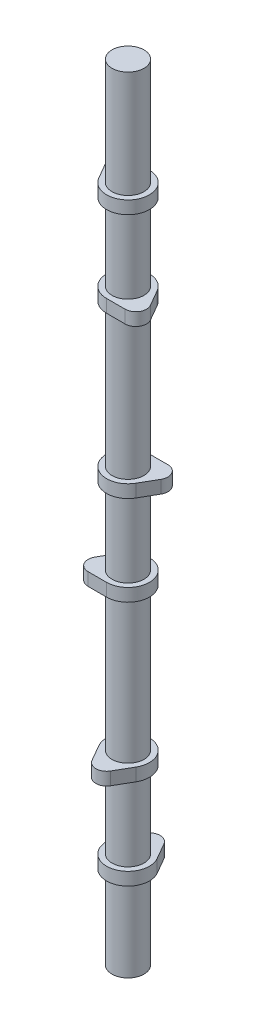
ISO-10303-21;
HEADER;
FILE_DESCRIPTION(('STEP AP214'),'2;1');
FILE_NAME('part.step','',(''),(''),'','','');
FILE_SCHEMA(('AUTOMOTIVE_DESIGN { 1 0 10303 214 1 1 1 1 }'));
ENDSEC;
DATA;
#1=APPLICATION_CONTEXT('core data for automotive mechanical design processes');
#2=APPLICATION_PROTOCOL_DEFINITION('international standard','automotive_design',2000,#1);
#3=PRODUCT_CONTEXT('',#1,'mechanical');
#4=PRODUCT('Part','Part','',(#3));
#5=PRODUCT_RELATED_PRODUCT_CATEGORY('part','',(#4));
#6=PRODUCT_DEFINITION_FORMATION('','',#4);
#7=PRODUCT_DEFINITION_CONTEXT('part definition',#1,'design');
#8=PRODUCT_DEFINITION('design','',#6,#7);
#9=PRODUCT_DEFINITION_SHAPE('','',#8);
#10=(LENGTH_UNIT() NAMED_UNIT(*) SI_UNIT(.MILLI.,.METRE.));
#11=(NAMED_UNIT(*) PLANE_ANGLE_UNIT() SI_UNIT($,.RADIAN.));
#12=(NAMED_UNIT(*) SI_UNIT($,.STERADIAN.) SOLID_ANGLE_UNIT());
#13=UNCERTAINTY_MEASURE_WITH_UNIT(LENGTH_MEASURE(1.E-05),#10,'distance_accuracy_value','');
#14=(GEOMETRIC_REPRESENTATION_CONTEXT(3) GLOBAL_UNCERTAINTY_ASSIGNED_CONTEXT((#13)) GLOBAL_UNIT_ASSIGNED_CONTEXT((#10,
#11,#12)) REPRESENTATION_CONTEXT('',''));
#15=CARTESIAN_POINT('',(0.,0.,0.));
#16=DIRECTION('',(0.,0.,1.));
#17=DIRECTION('',(1.,0.,0.));
#18=AXIS2_PLACEMENT_3D('',#15,#16,#17);
#19=CARTESIAN_POINT('',(0.,416.56,0.));
#20=DIRECTION('',(0.,-1.,0.));
#21=DIRECTION('',(0.,0.,-1.));
#22=AXIS2_PLACEMENT_3D('',#19,#20,#21);
#23=CYLINDRICAL_SURFACE('',#22,9.5);
#24=CARTESIAN_POINT('',(0.,207.01,0.));
#25=DIRECTION('',(0.,1.,0.));
#26=DIRECTION('',(0.,0.,1.));
#27=AXIS2_PLACEMENT_3D('',#24,#25,#26);
#28=CIRCLE('',#27,9.5);
#29=CARTESIAN_POINT('',(0.,207.01,9.5));
#30=VERTEX_POINT('',#29);
#31=EDGE_CURVE('E297',#30,#30,#28,.T.);
#32=ORIENTED_EDGE('',*,*,#31,.T.);
#33=EDGE_LOOP('',(#32));
#34=FACE_BOUND('',#33,.T.);
#35=CARTESIAN_POINT('',(0.,292.1,0.));
#36=DIRECTION('',(0.,1.,0.));
#37=DIRECTION('',(0.,0.,1.));
#38=AXIS2_PLACEMENT_3D('',#35,#36,#37);
#39=CIRCLE('',#38,9.5);
#40=CARTESIAN_POINT('',(0.,292.1,9.5));
#41=VERTEX_POINT('',#40);
#42=EDGE_CURVE('E11',#41,#41,#39,.T.);
#43=ORIENTED_EDGE('',*,*,#42,.F.);
#44=EDGE_LOOP('',(#43));
#45=FACE_BOUND('',#44,.T.);
#46=ADVANCED_FACE('F32',(#34,#45),#23,.T.);
#47=CARTESIAN_POINT('',(0.,153.67,0.));
#48=DIRECTION('',(0.,1.,0.));
#49=DIRECTION('',(0.,0.,1.));
#50=AXIS2_PLACEMENT_3D('',#47,#48,#49);
#51=CIRCLE('',#50,9.5);
#52=CARTESIAN_POINT('',(0.,153.67,9.5));
#53=VERTEX_POINT('',#52);
#54=EDGE_CURVE('E328',#53,#53,#51,.T.);
#55=ORIENTED_EDGE('',*,*,#54,.T.);
#56=EDGE_LOOP('',(#55));
#57=FACE_BOUND('',#56,.T.);
#58=CARTESIAN_POINT('',(0.,199.39,0.));
#59=DIRECTION('',(0.,1.,0.));
#60=DIRECTION('',(0.,0.,1.));
#61=AXIS2_PLACEMENT_3D('',#58,#59,#60);
#62=CIRCLE('',#61,9.5);
#63=CARTESIAN_POINT('',(0.,199.39,9.5));
#64=VERTEX_POINT('',#63);
#65=EDGE_CURVE('E401',#64,#64,#62,.T.);
#66=ORIENTED_EDGE('',*,*,#65,.F.);
#67=EDGE_LOOP('',(#66));
#68=FACE_BOUND('',#67,.T.);
#69=ADVANCED_FACE('F450',(#57,#68),#23,.T.);
#70=CARTESIAN_POINT('',(0.,60.96,0.));
#71=DIRECTION('',(0.,1.,0.));
#72=DIRECTION('',(0.,0.,1.));
#73=AXIS2_PLACEMENT_3D('',#70,#71,#72);
#74=CIRCLE('',#73,9.5);
#75=CARTESIAN_POINT('',(0.,60.96,9.5));
#76=VERTEX_POINT('',#75);
#77=EDGE_CURVE('E359',#76,#76,#74,.T.);
#78=ORIENTED_EDGE('',*,*,#77,.T.);
#79=EDGE_LOOP('',(#78));
#80=FACE_BOUND('',#79,.T.);
#81=CARTESIAN_POINT('',(0.,146.05,0.));
#82=DIRECTION('',(0.,1.,0.));
#83=DIRECTION('',(0.,0.,1.));
#84=AXIS2_PLACEMENT_3D('',#81,#82,#83);
#85=CIRCLE('',#84,9.5);
#86=CARTESIAN_POINT('',(0.,146.05,9.5));
#87=VERTEX_POINT('',#86);
#88=EDGE_CURVE('E396',#87,#87,#85,.T.);
#89=ORIENTED_EDGE('',*,*,#88,.F.);
#90=EDGE_LOOP('',(#89));
#91=FACE_BOUND('',#90,.T.);
#92=ADVANCED_FACE('F458',(#80,#91),#23,.T.);
#93=CARTESIAN_POINT('',(0.,7.62000000000002,0.));
#94=DIRECTION('',(0.,1.,0.));
#95=DIRECTION('',(0.,0.,1.));
#96=AXIS2_PLACEMENT_3D('',#93,#94,#95);
#97=CIRCLE('',#96,9.5);
#98=CARTESIAN_POINT('',(0.,7.62000000000002,9.5));
#99=VERTEX_POINT('',#98);
#100=EDGE_CURVE('E363',#99,#99,#97,.F.);
#101=ORIENTED_EDGE('',*,*,#100,.F.);
#102=EDGE_LOOP('',(#101));
#103=FACE_BOUND('',#102,.T.);
#104=CARTESIAN_POINT('',(0.,53.34,0.));
#105=DIRECTION('',(0.,1.,0.));
#106=DIRECTION('',(0.,0.,1.));
#107=AXIS2_PLACEMENT_3D('',#104,#105,#106);
#108=CIRCLE('',#107,9.5);
#109=CARTESIAN_POINT('',(0.,53.34,9.5));
#110=VERTEX_POINT('',#109);
#111=EDGE_CURVE('E393',#110,#110,#108,.T.);
#112=ORIENTED_EDGE('',*,*,#111,.F.);
#113=EDGE_LOOP('',(#112));
#114=FACE_BOUND('',#113,.T.);
#115=ADVANCED_FACE('F476',(#103,#114),#23,.T.);
#116=CARTESIAN_POINT('',(0.,7.62,-12.7));
#117=DIRECTION('',(0.,-1.,0.));
#118=DIRECTION('',(0.,0.,-1.));
#119=AXIS2_PLACEMENT_3D('',#116,#117,#118);
#120=CYLINDRICAL_SURFACE('',#119,6.35);
#121=CARTESIAN_POINT('',(0.,0.,-12.7));
#122=DIRECTION('',(0.,1.,0.));
#123=DIRECTION('',(0.,0.,1.));
#124=AXIS2_PLACEMENT_3D('',#121,#122,#123);
#125=CIRCLE('',#124,6.35);
#126=CARTESIAN_POINT('',(5.49926131403118,0.,-15.875));
#127=VERTEX_POINT('',#126);
#128=CARTESIAN_POINT('',(-5.49926131403118,0.,-15.875));
#129=VERTEX_POINT('',#128);
#130=EDGE_CURVE('E369',#127,#129,#125,.T.);
#131=ORIENTED_EDGE('',*,*,#130,.T.);
#132=DIRECTION('',(0.,-1.,0.));
#133=VECTOR('',#132,1.);
#134=CARTESIAN_POINT('',(-5.49926131403118,7.62,-15.875));
#135=LINE('',#134,#133);
#136=CARTESIAN_POINT('',(-5.49926131403118,7.62,-15.875));
#137=VERTEX_POINT('',#136);
#138=EDGE_CURVE('E388',#137,#129,#135,.T.);
#139=ORIENTED_EDGE('',*,*,#138,.F.);
#140=CARTESIAN_POINT('',(0.,7.62,-12.7));
#141=DIRECTION('',(0.,1.,0.));
#142=DIRECTION('',(0.,0.,1.));
#143=AXIS2_PLACEMENT_3D('',#140,#141,#142);
#144=CIRCLE('',#143,6.35);
#145=CARTESIAN_POINT('',(5.49926131403118,7.62,-15.875));
#146=VERTEX_POINT('',#145);
#147=EDGE_CURVE('E370',#146,#137,#144,.T.);
#148=ORIENTED_EDGE('',*,*,#147,.F.);
#149=DIRECTION('',(0.,-1.,0.));
#150=VECTOR('',#149,1.);
#151=CARTESIAN_POINT('',(5.49926131403118,7.62,-15.875));
#152=LINE('',#151,#150);
#153=EDGE_CURVE('E376',#146,#127,#152,.T.);
#154=ORIENTED_EDGE('',*,*,#153,.T.);
#155=EDGE_LOOP('',(#131,#139,#148,#154));
#156=FACE_BOUND('',#155,.T.);
#157=ADVANCED_FACE('F34',(#156),#120,.T.);
#158=CARTESIAN_POINT('',(-5.49926131403118,7.62,-15.875));
#159=DIRECTION('',(0.866025403784439,0.,0.5));
#160=DIRECTION('',(0.5,0.,-0.866025403784439));
#161=AXIS2_PLACEMENT_3D('',#158,#159,#160);
#162=PLANE('',#161);
#163=DIRECTION('',(-0.5,0.,0.866025403784439));
#164=VECTOR('',#163,1.);
#165=CARTESIAN_POINT('',(-5.49926131403118,0.,-15.875));
#166=LINE('',#165,#164);
#167=CARTESIAN_POINT('',(-10.9985226280624,0.,-6.35));
#168=VERTEX_POINT('',#167);
#169=EDGE_CURVE('E379',#129,#168,#166,.T.);
#170=ORIENTED_EDGE('',*,*,#169,.T.);
#171=DIRECTION('',(0.,-1.,0.));
#172=VECTOR('',#171,1.);
#173=CARTESIAN_POINT('',(-10.9985226280624,7.62,-6.35));
#174=LINE('',#173,#172);
#175=CARTESIAN_POINT('',(-10.9985226280624,7.62,-6.35));
#176=VERTEX_POINT('',#175);
#177=EDGE_CURVE('E386',#176,#168,#174,.T.);
#178=ORIENTED_EDGE('',*,*,#177,.F.);
#179=DIRECTION('',(-0.5,0.,0.866025403784439));
#180=VECTOR('',#179,1.);
#181=CARTESIAN_POINT('',(-5.49926131403118,7.62,-15.875));
#182=LINE('',#181,#180);
#183=EDGE_CURVE('E82',#137,#176,#182,.T.);
#184=ORIENTED_EDGE('',*,*,#183,.F.);
#185=ORIENTED_EDGE('',*,*,#138,.T.);
#186=EDGE_LOOP('',(#170,#178,#184,#185));
#187=FACE_BOUND('',#186,.T.);
#188=ADVANCED_FACE('F493',(#187),#162,.F.);
#189=CARTESIAN_POINT('',(0.,7.62,0.));
#190=DIRECTION('',(0.,-1.,0.));
#191=DIRECTION('',(0.,0.,-1.));
#192=AXIS2_PLACEMENT_3D('',#189,#190,#191);
#193=CYLINDRICAL_SURFACE('',#192,12.7);
#194=CARTESIAN_POINT('',(0.,0.,0.));
#195=DIRECTION('',(0.,1.,0.));
#196=DIRECTION('',(0.,0.,1.));
#197=AXIS2_PLACEMENT_3D('',#194,#195,#196);
#198=CIRCLE('',#197,12.7);
#199=CARTESIAN_POINT('',(10.9985226280624,0.,-6.35000000000001));
#200=VERTEX_POINT('',#199);
#201=EDGE_CURVE('E68',#168,#200,#198,.T.);
#202=ORIENTED_EDGE('',*,*,#201,.T.);
#203=DIRECTION('',(0.,-1.,0.));
#204=VECTOR('',#203,1.);
#205=CARTESIAN_POINT('',(10.9985226280624,7.62,-6.35000000000001));
#206=LINE('',#205,#204);
#207=CARTESIAN_POINT('',(10.9985226280624,7.62,-6.35000000000001));
#208=VERTEX_POINT('',#207);
#209=EDGE_CURVE('E384',#208,#200,#206,.T.);
#210=ORIENTED_EDGE('',*,*,#209,.F.);
#211=CARTESIAN_POINT('',(0.,7.62,0.));
#212=DIRECTION('',(0.,1.,0.));
#213=DIRECTION('',(0.,0.,1.));
#214=AXIS2_PLACEMENT_3D('',#211,#212,#213);
#215=CIRCLE('',#214,12.7);
#216=EDGE_CURVE('E373',#176,#208,#215,.T.);
#217=ORIENTED_EDGE('',*,*,#216,.F.);
#218=ORIENTED_EDGE('',*,*,#177,.T.);
#219=EDGE_LOOP('',(#202,#210,#217,#218));
#220=FACE_BOUND('',#219,.T.);
#221=ADVANCED_FACE('F824',(#220),#193,.T.);
#222=CARTESIAN_POINT('',(5.49926131403118,7.62,-15.875));
#223=DIRECTION('',(-0.866025403784438,0.,0.5));
#224=DIRECTION('',(0.5,0.,0.866025403784439));
#225=AXIS2_PLACEMENT_3D('',#222,#223,#224);
#226=PLANE('',#225);
#227=DIRECTION('',(-0.5,0.,-0.866025403784439));
#228=VECTOR('',#227,1.);
#229=CARTESIAN_POINT('',(5.49926131403118,0.,-15.875));
#230=LINE('',#229,#228);
#231=EDGE_CURVE('E74',#200,#127,#230,.T.);
#232=ORIENTED_EDGE('',*,*,#231,.T.);
#233=ORIENTED_EDGE('',*,*,#153,.F.);
#234=DIRECTION('',(-0.5,0.,-0.866025403784439));
#235=VECTOR('',#234,1.);
#236=CARTESIAN_POINT('',(5.49926131403118,7.62,-15.875));
#237=LINE('',#236,#235);
#238=EDGE_CURVE('E50',#208,#146,#237,.T.);
#239=ORIENTED_EDGE('',*,*,#238,.F.);
#240=ORIENTED_EDGE('',*,*,#209,.T.);
#241=EDGE_LOOP('',(#232,#233,#239,#240));
#242=FACE_BOUND('',#241,.T.);
#243=ADVANCED_FACE('F818',(#242),#226,.F.);
#244=CARTESIAN_POINT('',(0.,7.62,-12.7));
#245=DIRECTION('',(0.,1.,0.));
#246=DIRECTION('',(0.,0.,1.));
#247=AXIS2_PLACEMENT_3D('',#244,#245,#246);
#248=PLANE('',#247);
#249=ORIENTED_EDGE('',*,*,#100,.T.);
#250=EDGE_LOOP('',(#249));
#251=FACE_BOUND('',#250,.T.);
#252=ORIENTED_EDGE('',*,*,#147,.T.);
#253=ORIENTED_EDGE('',*,*,#183,.T.);
#254=ORIENTED_EDGE('',*,*,#216,.T.);
#255=ORIENTED_EDGE('',*,*,#238,.T.);
#256=EDGE_LOOP('',(#252,#253,#254,#255));
#257=FACE_BOUND('',#256,.T.);
#258=ADVANCED_FACE('F823',(#251,#257),#248,.T.);
#259=CARTESIAN_POINT('',(0.,0.,-12.7));
#260=DIRECTION('',(0.,1.,0.));
#261=DIRECTION('',(0.,0.,1.));
#262=AXIS2_PLACEMENT_3D('',#259,#260,#261);
#263=PLANE('',#262);
#264=CARTESIAN_POINT('',(0.,0.,0.));
#265=DIRECTION('',(0.,1.,0.));
#266=DIRECTION('',(0.,0.,1.));
#267=AXIS2_PLACEMENT_3D('',#264,#265,#266);
#268=CIRCLE('',#267,9.5);
#269=CARTESIAN_POINT('',(0.,0.,9.5));
#270=VERTEX_POINT('',#269);
#271=EDGE_CURVE('E390',#270,#270,#268,.F.);
#272=ORIENTED_EDGE('',*,*,#271,.F.);
#273=EDGE_LOOP('',(#272));
#274=FACE_BOUND('',#273,.T.);
#275=ORIENTED_EDGE('',*,*,#130,.F.);
#276=ORIENTED_EDGE('',*,*,#231,.F.);
#277=ORIENTED_EDGE('',*,*,#201,.F.);
#278=ORIENTED_EDGE('',*,*,#169,.F.);
#279=EDGE_LOOP('',(#275,#276,#277,#278));
#280=FACE_BOUND('',#279,.T.);
#281=ADVANCED_FACE('F484',(#274,#280),#263,.F.);
#282=CARTESIAN_POINT('',(0.,-49.53,0.));
#283=DIRECTION('',(0.,1.,0.));
#284=DIRECTION('',(0.,0.,1.));
#285=AXIS2_PLACEMENT_3D('',#282,#283,#284);
#286=PLANE('',#285);
#287=CARTESIAN_POINT('',(0.,-49.53,0.));
#288=DIRECTION('',(0.,1.,0.));
#289=DIRECTION('',(0.,0.,1.));
#290=AXIS2_PLACEMENT_3D('',#287,#288,#289);
#291=CIRCLE('',#290,9.5);
#292=CARTESIAN_POINT('',(0.,-49.53,9.5));
#293=VERTEX_POINT('',#292);
#294=EDGE_CURVE('E364',#293,#293,#291,.T.);
#295=ORIENTED_EDGE('',*,*,#294,.F.);
#296=EDGE_LOOP('',(#295));
#297=FACE_BOUND('',#296,.T.);
#298=ADVANCED_FACE('F474',(#297),#286,.F.);
#299=ORIENTED_EDGE('',*,*,#294,.T.);
#300=EDGE_LOOP('',(#299));
#301=FACE_BOUND('',#300,.T.);
#302=ORIENTED_EDGE('',*,*,#271,.T.);
#303=EDGE_LOOP('',(#302));
#304=FACE_BOUND('',#303,.T.);
#305=ADVANCED_FACE('F465',(#301,#304),#23,.T.);
#306=CARTESIAN_POINT('',(0.,60.96,12.7));
#307=DIRECTION('',(0.,-1.,0.));
#308=DIRECTION('',(0.,0.,1.));
#309=AXIS2_PLACEMENT_3D('',#306,#307,#308);
#310=CYLINDRICAL_SURFACE('',#309,6.35);
#311=CARTESIAN_POINT('',(0.,53.34,12.7));
#312=DIRECTION('',(0.,1.,0.));
#313=DIRECTION('',(0.,0.,-1.));
#314=AXIS2_PLACEMENT_3D('',#311,#312,#313);
#315=CIRCLE('',#314,6.35);
#316=CARTESIAN_POINT('',(-5.49926131403129,53.34,15.875));
#317=VERTEX_POINT('',#316);
#318=CARTESIAN_POINT('',(5.49926131403107,53.34,15.875));
#319=VERTEX_POINT('',#318);
#320=EDGE_CURVE('E340',#317,#319,#315,.T.);
#321=ORIENTED_EDGE('',*,*,#320,.T.);
#322=DIRECTION('',(0.,-1.,0.));
#323=VECTOR('',#322,1.);
#324=CARTESIAN_POINT('',(5.49926131403107,60.96,15.875));
#325=LINE('',#324,#323);
#326=CARTESIAN_POINT('',(5.49926131403107,60.96,15.875));
#327=VERTEX_POINT('',#326);
#328=EDGE_CURVE('E356',#327,#319,#325,.T.);
#329=ORIENTED_EDGE('',*,*,#328,.F.);
#330=CARTESIAN_POINT('',(0.,60.96,12.7));
#331=DIRECTION('',(0.,1.,0.));
#332=DIRECTION('',(0.,0.,-1.));
#333=AXIS2_PLACEMENT_3D('',#330,#331,#332);
#334=CIRCLE('',#333,6.35);
#335=CARTESIAN_POINT('',(-5.49926131403129,60.96,15.875));
#336=VERTEX_POINT('',#335);
#337=EDGE_CURVE('E329',#336,#327,#334,.T.);
#338=ORIENTED_EDGE('',*,*,#337,.F.);
#339=DIRECTION('',(0.,-1.,0.));
#340=VECTOR('',#339,1.);
#341=CARTESIAN_POINT('',(-5.49926131403129,60.96,15.875));
#342=LINE('',#341,#340);
#343=EDGE_CURVE('E339',#336,#317,#342,.T.);
#344=ORIENTED_EDGE('',*,*,#343,.T.);
#345=EDGE_LOOP('',(#321,#329,#338,#344));
#346=FACE_BOUND('',#345,.T.);
#347=ADVANCED_FACE('F473',(#346),#310,.T.);
#348=CARTESIAN_POINT('',(5.49926131403107,60.96,15.875));
#349=DIRECTION('',(-0.866025403784435,0.,-0.500000000000006));
#350=DIRECTION('',(-0.500000000000006,0.,0.866025403784435));
#351=AXIS2_PLACEMENT_3D('',#348,#349,#350);
#352=PLANE('',#351);
#353=DIRECTION('',(0.500000000000006,0.,-0.866025403784435));
#354=VECTOR('',#353,1.);
#355=CARTESIAN_POINT('',(5.49926131403107,53.34,15.875));
#356=LINE('',#355,#354);
#357=CARTESIAN_POINT('',(10.9985226280623,53.34,6.35000000000008));
#358=VERTEX_POINT('',#357);
#359=EDGE_CURVE('E343',#319,#358,#356,.T.);
#360=ORIENTED_EDGE('',*,*,#359,.T.);
#361=DIRECTION('',(0.,-1.,0.));
#362=VECTOR('',#361,1.);
#363=CARTESIAN_POINT('',(10.9985226280623,60.96,6.35000000000008));
#364=LINE('',#363,#362);
#365=CARTESIAN_POINT('',(10.9985226280623,60.96,6.35000000000008));
#366=VERTEX_POINT('',#365);
#367=EDGE_CURVE('E353',#366,#358,#364,.T.);
#368=ORIENTED_EDGE('',*,*,#367,.F.);
#369=DIRECTION('',(0.500000000000006,0.,-0.866025403784435));
#370=VECTOR('',#369,1.);
#371=CARTESIAN_POINT('',(5.49926131403107,60.96,15.875));
#372=LINE('',#371,#370);
#373=EDGE_CURVE('E332',#327,#366,#372,.T.);
#374=ORIENTED_EDGE('',*,*,#373,.F.);
#375=ORIENTED_EDGE('',*,*,#328,.T.);
#376=EDGE_LOOP('',(#360,#368,#374,#375));
#377=FACE_BOUND('',#376,.T.);
#378=ADVANCED_FACE('F481',(#377),#352,.F.);
#379=CARTESIAN_POINT('',(0.,60.96,0.));
#380=DIRECTION('',(0.,-1.,0.));
#381=DIRECTION('',(0.,0.,1.));
#382=AXIS2_PLACEMENT_3D('',#379,#380,#381);
#383=CYLINDRICAL_SURFACE('',#382,12.7);
#384=CARTESIAN_POINT('',(0.,53.34,0.));
#385=DIRECTION('',(0.,1.,0.));
#386=DIRECTION('',(0.,0.,-1.));
#387=AXIS2_PLACEMENT_3D('',#384,#385,#386);
#388=CIRCLE('',#387,12.7);
#389=CARTESIAN_POINT('',(-10.9985226280624,53.34,6.34999999999993));
#390=VERTEX_POINT('',#389);
#391=EDGE_CURVE('E345',#358,#390,#388,.T.);
#392=ORIENTED_EDGE('',*,*,#391,.T.);
#393=DIRECTION('',(0.,-1.,0.));
#394=VECTOR('',#393,1.);
#395=CARTESIAN_POINT('',(-10.9985226280624,60.96,6.34999999999993));
#396=LINE('',#395,#394);
#397=CARTESIAN_POINT('',(-10.9985226280624,60.96,6.34999999999993));
#398=VERTEX_POINT('',#397);
#399=EDGE_CURVE('E350',#398,#390,#396,.T.);
#400=ORIENTED_EDGE('',*,*,#399,.F.);
#401=CARTESIAN_POINT('',(0.,60.96,0.));
#402=DIRECTION('',(0.,1.,0.));
#403=DIRECTION('',(0.,0.,-1.));
#404=AXIS2_PLACEMENT_3D('',#401,#402,#403);
#405=CIRCLE('',#404,12.7);
#406=EDGE_CURVE('E335',#366,#398,#405,.T.);
#407=ORIENTED_EDGE('',*,*,#406,.F.);
#408=ORIENTED_EDGE('',*,*,#367,.T.);
#409=EDGE_LOOP('',(#392,#400,#407,#408));
#410=FACE_BOUND('',#409,.T.);
#411=ADVANCED_FACE('F518',(#410),#383,.T.);
#412=CARTESIAN_POINT('',(-5.49926131403129,60.96,15.875));
#413=DIRECTION('',(0.866025403784442,0.,-0.499999999999994));
#414=DIRECTION('',(-0.499999999999994,0.,-0.866025403784442));
#415=AXIS2_PLACEMENT_3D('',#412,#413,#414);
#416=PLANE('',#415);
#417=DIRECTION('',(0.499999999999994,0.,0.866025403784442));
#418=VECTOR('',#417,1.);
#419=CARTESIAN_POINT('',(-5.49926131403129,53.34,15.875));
#420=LINE('',#419,#418);
#421=EDGE_CURVE('E333',#390,#317,#420,.T.);
#422=ORIENTED_EDGE('',*,*,#421,.T.);
#423=ORIENTED_EDGE('',*,*,#343,.F.);
#424=DIRECTION('',(0.499999999999994,0.,0.866025403784442));
#425=VECTOR('',#424,1.);
#426=CARTESIAN_POINT('',(-5.49926131403129,60.96,15.875));
#427=LINE('',#426,#425);
#428=EDGE_CURVE('E337',#398,#336,#427,.T.);
#429=ORIENTED_EDGE('',*,*,#428,.F.);
#430=ORIENTED_EDGE('',*,*,#399,.T.);
#431=EDGE_LOOP('',(#422,#423,#429,#430));
#432=FACE_BOUND('',#431,.T.);
#433=ADVANCED_FACE('F514',(#432),#416,.F.);
#434=CARTESIAN_POINT('',(0.,60.96,12.7));
#435=DIRECTION('',(0.,1.,0.));
#436=DIRECTION('',(0.,0.,-1.));
#437=AXIS2_PLACEMENT_3D('',#434,#435,#436);
#438=PLANE('',#437);
#439=ORIENTED_EDGE('',*,*,#77,.F.);
#440=EDGE_LOOP('',(#439));
#441=FACE_BOUND('',#440,.T.);
#442=ORIENTED_EDGE('',*,*,#337,.T.);
#443=ORIENTED_EDGE('',*,*,#373,.T.);
#444=ORIENTED_EDGE('',*,*,#406,.T.);
#445=ORIENTED_EDGE('',*,*,#428,.T.);
#446=EDGE_LOOP('',(#442,#443,#444,#445));
#447=FACE_BOUND('',#446,.T.);
#448=ADVANCED_FACE('F504',(#441,#447),#438,.T.);
#449=CARTESIAN_POINT('',(0.,53.34,12.7));
#450=DIRECTION('',(0.,1.,0.));
#451=DIRECTION('',(0.,0.,-1.));
#452=AXIS2_PLACEMENT_3D('',#449,#450,#451);
#453=PLANE('',#452);
#454=ORIENTED_EDGE('',*,*,#111,.T.);
#455=EDGE_LOOP('',(#454));
#456=FACE_BOUND('',#455,.T.);
#457=ORIENTED_EDGE('',*,*,#320,.F.);
#458=ORIENTED_EDGE('',*,*,#421,.F.);
#459=ORIENTED_EDGE('',*,*,#391,.F.);
#460=ORIENTED_EDGE('',*,*,#359,.F.);
#461=EDGE_LOOP('',(#457,#458,#459,#460));
#462=FACE_BOUND('',#461,.T.);
#463=ADVANCED_FACE('F500',(#456,#462),#453,.F.);
#464=CARTESIAN_POINT('',(-10.9985226280623,153.67,6.35000000000005));
#465=DIRECTION('',(0.,-1.,0.));
#466=DIRECTION('',(-0.866025403784436,0.,0.500000000000004));
#467=AXIS2_PLACEMENT_3D('',#464,#465,#466);
#468=CYLINDRICAL_SURFACE('',#467,6.35);
#469=CARTESIAN_POINT('',(-10.9985226280623,146.05,6.35000000000005));
#470=DIRECTION('',(0.,1.,0.));
#471=DIRECTION('',(0.866025403784436,0.,-0.500000000000004));
#472=AXIS2_PLACEMENT_3D('',#469,#470,#471);
#473=CIRCLE('',#472,6.35);
#474=CARTESIAN_POINT('',(-16.4977839420935,146.05,3.17500000000008));
#475=VERTEX_POINT('',#474);
#476=CARTESIAN_POINT('',(-10.9985226280623,146.05,12.7000000000001));
#477=VERTEX_POINT('',#476);
#478=EDGE_CURVE('E309',#475,#477,#473,.T.);
#479=ORIENTED_EDGE('',*,*,#478,.T.);
#480=DIRECTION('',(0.,-1.,0.));
#481=VECTOR('',#480,1.);
#482=CARTESIAN_POINT('',(-10.9985226280623,153.67,12.7000000000001));
#483=LINE('',#482,#481);
#484=CARTESIAN_POINT('',(-10.9985226280623,153.67,12.7000000000001));
#485=VERTEX_POINT('',#484);
#486=EDGE_CURVE('E325',#485,#477,#483,.T.);
#487=ORIENTED_EDGE('',*,*,#486,.F.);
#488=CARTESIAN_POINT('',(-10.9985226280623,153.67,6.35000000000005));
#489=DIRECTION('',(0.,1.,0.));
#490=DIRECTION('',(0.866025403784436,0.,-0.500000000000004));
#491=AXIS2_PLACEMENT_3D('',#488,#489,#490);
#492=CIRCLE('',#491,6.35);
#493=CARTESIAN_POINT('',(-16.4977839420935,153.67,3.17500000000008));
#494=VERTEX_POINT('',#493);
#495=EDGE_CURVE('E298',#494,#485,#492,.T.);
#496=ORIENTED_EDGE('',*,*,#495,.F.);
#497=DIRECTION('',(0.,-1.,0.));
#498=VECTOR('',#497,1.);
#499=CARTESIAN_POINT('',(-16.4977839420935,153.67,3.17500000000008));
#500=LINE('',#499,#498);
#501=EDGE_CURVE('E308',#494,#475,#500,.T.);
#502=ORIENTED_EDGE('',*,*,#501,.T.);
#503=EDGE_LOOP('',(#479,#487,#496,#502));
#504=FACE_BOUND('',#503,.T.);
#505=ADVANCED_FACE('F503',(#504),#468,.T.);
#506=CARTESIAN_POINT('',(-10.9985226280623,153.67,12.7000000000001));
#507=DIRECTION('',(0.,0.,-1.));
#508=DIRECTION('',(-1.,0.,0.));
#509=AXIS2_PLACEMENT_3D('',#506,#507,#508);
#510=PLANE('',#509);
#511=DIRECTION('',(1.,0.,0.));
#512=VECTOR('',#511,1.);
#513=CARTESIAN_POINT('',(-10.9985226280623,146.05,12.7000000000001));
#514=LINE('',#513,#512);
#515=CARTESIAN_POINT('',(0.,146.05,12.7));
#516=VERTEX_POINT('',#515);
#517=EDGE_CURVE('E312',#477,#516,#514,.T.);
#518=ORIENTED_EDGE('',*,*,#517,.T.);
#519=DIRECTION('',(0.,-1.,0.));
#520=VECTOR('',#519,1.);
#521=CARTESIAN_POINT('',(0.,153.67,12.7));
#522=LINE('',#521,#520);
#523=CARTESIAN_POINT('',(0.,153.67,12.7));
#524=VERTEX_POINT('',#523);
#525=EDGE_CURVE('E322',#524,#516,#522,.T.);
#526=ORIENTED_EDGE('',*,*,#525,.F.);
#527=DIRECTION('',(1.,0.,0.));
#528=VECTOR('',#527,1.);
#529=CARTESIAN_POINT('',(-10.9985226280623,153.67,12.7000000000001));
#530=LINE('',#529,#528);
#531=EDGE_CURVE('E301',#485,#524,#530,.T.);
#532=ORIENTED_EDGE('',*,*,#531,.F.);
#533=ORIENTED_EDGE('',*,*,#486,.T.);
#534=EDGE_LOOP('',(#518,#526,#532,#533));
#535=FACE_BOUND('',#534,.T.);
#536=ADVANCED_FACE('F567',(#535),#510,.F.);
#537=CARTESIAN_POINT('',(0.,153.67,0.));
#538=DIRECTION('',(0.,-1.,0.));
#539=DIRECTION('',(-0.866025403784436,0.,0.500000000000004));
#540=AXIS2_PLACEMENT_3D('',#537,#538,#539);
#541=CYLINDRICAL_SURFACE('',#540,12.7);
#542=CARTESIAN_POINT('',(0.,146.05,0.));
#543=DIRECTION('',(0.,1.,0.));
#544=DIRECTION('',(0.866025403784436,0.,-0.500000000000004));
#545=AXIS2_PLACEMENT_3D('',#542,#543,#544);
#546=CIRCLE('',#545,12.7);
#547=CARTESIAN_POINT('',(-10.9985226280624,146.05,-6.34999999999994));
#548=VERTEX_POINT('',#547);
#549=EDGE_CURVE('E314',#516,#548,#546,.T.);
#550=ORIENTED_EDGE('',*,*,#549,.T.);
#551=DIRECTION('',(0.,-1.,0.));
#552=VECTOR('',#551,1.);
#553=CARTESIAN_POINT('',(-10.9985226280624,153.67,-6.34999999999994));
#554=LINE('',#553,#552);
#555=CARTESIAN_POINT('',(-10.9985226280624,153.67,-6.34999999999994));
#556=VERTEX_POINT('',#555);
#557=EDGE_CURVE('E319',#556,#548,#554,.T.);
#558=ORIENTED_EDGE('',*,*,#557,.F.);
#559=CARTESIAN_POINT('',(0.,153.67,0.));
#560=DIRECTION('',(0.,1.,0.));
#561=DIRECTION('',(0.866025403784436,0.,-0.500000000000004));
#562=AXIS2_PLACEMENT_3D('',#559,#560,#561);
#563=CIRCLE('',#562,12.7);
#564=EDGE_CURVE('E304',#524,#556,#563,.T.);
#565=ORIENTED_EDGE('',*,*,#564,.F.);
#566=ORIENTED_EDGE('',*,*,#525,.T.);
#567=EDGE_LOOP('',(#550,#558,#565,#566));
#568=FACE_BOUND('',#567,.T.);
#569=ADVANCED_FACE('F576',(#568),#541,.T.);
#570=CARTESIAN_POINT('',(-16.4977839420935,153.67,3.17500000000008));
#571=DIRECTION('',(0.866025403784441,0.,0.499999999999996));
#572=DIRECTION('',(0.499999999999996,0.,-0.866025403784441));
#573=AXIS2_PLACEMENT_3D('',#570,#571,#572);
#574=PLANE('',#573);
#575=DIRECTION('',(-0.499999999999996,0.,0.866025403784441));
#576=VECTOR('',#575,1.);
#577=CARTESIAN_POINT('',(-16.4977839420935,146.05,3.17500000000008));
#578=LINE('',#577,#576);
#579=EDGE_CURVE('E302',#548,#475,#578,.T.);
#580=ORIENTED_EDGE('',*,*,#579,.T.);
#581=ORIENTED_EDGE('',*,*,#501,.F.);
#582=DIRECTION('',(-0.499999999999996,0.,0.866025403784441));
#583=VECTOR('',#582,1.);
#584=CARTESIAN_POINT('',(-16.4977839420935,153.67,3.17500000000008));
#585=LINE('',#584,#583);
#586=EDGE_CURVE('E306',#556,#494,#585,.T.);
#587=ORIENTED_EDGE('',*,*,#586,.F.);
#588=ORIENTED_EDGE('',*,*,#557,.T.);
#589=EDGE_LOOP('',(#580,#581,#587,#588));
#590=FACE_BOUND('',#589,.T.);
#591=ADVANCED_FACE('F585',(#590),#574,.F.);
#592=CARTESIAN_POINT('',(-10.9985226280623,153.67,6.35000000000005));
#593=DIRECTION('',(0.,1.,0.));
#594=DIRECTION('',(0.866025403784436,0.,-0.500000000000004));
#595=AXIS2_PLACEMENT_3D('',#592,#593,#594);
#596=PLANE('',#595);
#597=ORIENTED_EDGE('',*,*,#54,.F.);
#598=EDGE_LOOP('',(#597));
#599=FACE_BOUND('',#598,.T.);
#600=ORIENTED_EDGE('',*,*,#495,.T.);
#601=ORIENTED_EDGE('',*,*,#531,.T.);
#602=ORIENTED_EDGE('',*,*,#564,.T.);
#603=ORIENTED_EDGE('',*,*,#586,.T.);
#604=EDGE_LOOP('',(#600,#601,#602,#603));
#605=FACE_BOUND('',#604,.T.);
#606=ADVANCED_FACE('F595',(#599,#605),#596,.T.);
#607=CARTESIAN_POINT('',(-10.9985226280623,146.05,6.35000000000005));
#608=DIRECTION('',(0.,1.,0.));
#609=DIRECTION('',(0.866025403784436,0.,-0.500000000000004));
#610=AXIS2_PLACEMENT_3D('',#607,#608,#609);
#611=PLANE('',#610);
#612=ORIENTED_EDGE('',*,*,#88,.T.);
#613=EDGE_LOOP('',(#612));
#614=FACE_BOUND('',#613,.T.);
#615=ORIENTED_EDGE('',*,*,#478,.F.);
#616=ORIENTED_EDGE('',*,*,#579,.F.);
#617=ORIENTED_EDGE('',*,*,#549,.F.);
#618=ORIENTED_EDGE('',*,*,#517,.F.);
#619=EDGE_LOOP('',(#615,#616,#617,#618));
#620=FACE_BOUND('',#619,.T.);
#621=ADVANCED_FACE('F605',(#614,#620),#611,.F.);
#622=CARTESIAN_POINT('',(10.9985226280624,207.01,-6.34999999999997));
#623=DIRECTION('',(0.,-1.,0.));
#624=DIRECTION('',(0.86602540378444,0.,-0.499999999999998));
#625=AXIS2_PLACEMENT_3D('',#622,#623,#624);
#626=CYLINDRICAL_SURFACE('',#625,6.35);
#627=CARTESIAN_POINT('',(10.9985226280624,199.39,-6.34999999999997));
#628=DIRECTION('',(0.,1.,0.));
#629=DIRECTION('',(-0.86602540378444,0.,0.499999999999998));
#630=AXIS2_PLACEMENT_3D('',#627,#628,#629);
#631=CIRCLE('',#630,6.35);
#632=CARTESIAN_POINT('',(16.4977839420936,199.39,-3.17499999999996));
#633=VERTEX_POINT('',#632);
#634=CARTESIAN_POINT('',(10.9985226280624,199.39,-12.7));
#635=VERTEX_POINT('',#634);
#636=EDGE_CURVE('E278',#633,#635,#631,.T.);
#637=ORIENTED_EDGE('',*,*,#636,.T.);
#638=DIRECTION('',(0.,-1.,0.));
#639=VECTOR('',#638,1.);
#640=CARTESIAN_POINT('',(10.9985226280624,207.01,-12.7));
#641=LINE('',#640,#639);
#642=CARTESIAN_POINT('',(10.9985226280624,207.01,-12.7));
#643=VERTEX_POINT('',#642);
#644=EDGE_CURVE('E294',#643,#635,#641,.T.);
#645=ORIENTED_EDGE('',*,*,#644,.F.);
#646=CARTESIAN_POINT('',(10.9985226280624,207.01,-6.34999999999997));
#647=DIRECTION('',(0.,1.,0.));
#648=DIRECTION('',(-0.86602540378444,0.,0.499999999999998));
#649=AXIS2_PLACEMENT_3D('',#646,#647,#648);
#650=CIRCLE('',#649,6.35);
#651=CARTESIAN_POINT('',(16.4977839420936,207.01,-3.17499999999996));
#652=VERTEX_POINT('',#651);
#653=EDGE_CURVE('E267',#652,#643,#650,.T.);
#654=ORIENTED_EDGE('',*,*,#653,.F.);
#655=DIRECTION('',(0.,-1.,0.));
#656=VECTOR('',#655,1.);
#657=CARTESIAN_POINT('',(16.4977839420936,207.01,-3.17499999999996));
#658=LINE('',#657,#656);
#659=EDGE_CURVE('E277',#652,#633,#658,.T.);
#660=ORIENTED_EDGE('',*,*,#659,.T.);
#661=EDGE_LOOP('',(#637,#645,#654,#660));
#662=FACE_BOUND('',#661,.T.);
#663=ADVANCED_FACE('F615',(#662),#626,.T.);
#664=CARTESIAN_POINT('',(10.9985226280624,207.01,-12.7));
#665=DIRECTION('',(0.,0.,1.));
#666=DIRECTION('',(1.,0.,0.));
#667=AXIS2_PLACEMENT_3D('',#664,#665,#666);
#668=PLANE('',#667);
#669=DIRECTION('',(-1.,0.,0.));
#670=VECTOR('',#669,1.);
#671=CARTESIAN_POINT('',(10.9985226280624,199.39,-12.7));
#672=LINE('',#671,#670);
#673=CARTESIAN_POINT('',(0.,199.39,-12.7));
#674=VERTEX_POINT('',#673);
#675=EDGE_CURVE('E281',#635,#674,#672,.T.);
#676=ORIENTED_EDGE('',*,*,#675,.T.);
#677=DIRECTION('',(0.,-1.,0.));
#678=VECTOR('',#677,1.);
#679=CARTESIAN_POINT('',(0.,207.01,-12.7));
#680=LINE('',#679,#678);
#681=CARTESIAN_POINT('',(0.,207.01,-12.7));
#682=VERTEX_POINT('',#681);
#683=EDGE_CURVE('E291',#682,#674,#680,.T.);
#684=ORIENTED_EDGE('',*,*,#683,.F.);
#685=DIRECTION('',(-1.,0.,0.));
#686=VECTOR('',#685,1.);
#687=CARTESIAN_POINT('',(10.9985226280624,207.01,-12.7));
#688=LINE('',#687,#686);
#689=EDGE_CURVE('E270',#643,#682,#688,.T.);
#690=ORIENTED_EDGE('',*,*,#689,.F.);
#691=ORIENTED_EDGE('',*,*,#644,.T.);
#692=EDGE_LOOP('',(#676,#684,#690,#691));
#693=FACE_BOUND('',#692,.T.);
#694=ADVANCED_FACE('F625',(#693),#668,.F.);
#695=CARTESIAN_POINT('',(0.,207.01,0.));
#696=DIRECTION('',(0.,-1.,0.));
#697=DIRECTION('',(0.86602540378444,0.,-0.499999999999998));
#698=AXIS2_PLACEMENT_3D('',#695,#696,#697);
#699=CYLINDRICAL_SURFACE('',#698,12.7);
#700=CARTESIAN_POINT('',(0.,199.39,0.));
#701=DIRECTION('',(0.,1.,0.));
#702=DIRECTION('',(-0.86602540378444,0.,0.499999999999998));
#703=AXIS2_PLACEMENT_3D('',#700,#701,#702);
#704=CIRCLE('',#703,12.7);
#705=CARTESIAN_POINT('',(10.9985226280624,199.39,6.35000000000001));
#706=VERTEX_POINT('',#705);
#707=EDGE_CURVE('E283',#674,#706,#704,.T.);
#708=ORIENTED_EDGE('',*,*,#707,.T.);
#709=DIRECTION('',(0.,-1.,0.));
#710=VECTOR('',#709,1.);
#711=CARTESIAN_POINT('',(10.9985226280624,207.01,6.35000000000001));
#712=LINE('',#711,#710);
#713=CARTESIAN_POINT('',(10.9985226280624,207.01,6.35000000000001));
#714=VERTEX_POINT('',#713);
#715=EDGE_CURVE('E288',#714,#706,#712,.T.);
#716=ORIENTED_EDGE('',*,*,#715,.F.);
#717=CARTESIAN_POINT('',(0.,207.01,0.));
#718=DIRECTION('',(0.,1.,0.));
#719=DIRECTION('',(-0.86602540378444,0.,0.499999999999998));
#720=AXIS2_PLACEMENT_3D('',#717,#718,#719);
#721=CIRCLE('',#720,12.7);
#722=EDGE_CURVE('E273',#682,#714,#721,.T.);
#723=ORIENTED_EDGE('',*,*,#722,.F.);
#724=ORIENTED_EDGE('',*,*,#683,.T.);
#725=EDGE_LOOP('',(#708,#716,#723,#724));
#726=FACE_BOUND('',#725,.T.);
#727=ADVANCED_FACE('F635',(#726),#699,.T.);
#728=CARTESIAN_POINT('',(16.4977839420936,207.01,-3.17499999999996));
#729=DIRECTION('',(-0.866025403784437,0.,-0.500000000000002));
#730=DIRECTION('',(-0.500000000000002,0.,0.866025403784438));
#731=AXIS2_PLACEMENT_3D('',#728,#729,#730);
#732=PLANE('',#731);
#733=DIRECTION('',(0.500000000000002,0.,-0.866025403784438));
#734=VECTOR('',#733,1.);
#735=CARTESIAN_POINT('',(16.4977839420936,199.39,-3.17499999999996));
#736=LINE('',#735,#734);
#737=EDGE_CURVE('E271',#706,#633,#736,.T.);
#738=ORIENTED_EDGE('',*,*,#737,.T.);
#739=ORIENTED_EDGE('',*,*,#659,.F.);
#740=DIRECTION('',(0.500000000000002,0.,-0.866025403784438));
#741=VECTOR('',#740,1.);
#742=CARTESIAN_POINT('',(16.4977839420936,207.01,-3.17499999999996));
#743=LINE('',#742,#741);
#744=EDGE_CURVE('E275',#714,#652,#743,.T.);
#745=ORIENTED_EDGE('',*,*,#744,.F.);
#746=ORIENTED_EDGE('',*,*,#715,.T.);
#747=EDGE_LOOP('',(#738,#739,#745,#746));
#748=FACE_BOUND('',#747,.T.);
#749=ADVANCED_FACE('F645',(#748),#732,.F.);
#750=CARTESIAN_POINT('',(10.9985226280624,207.01,-6.34999999999997));
#751=DIRECTION('',(0.,1.,0.));
#752=DIRECTION('',(-0.86602540378444,0.,0.499999999999998));
#753=AXIS2_PLACEMENT_3D('',#750,#751,#752);
#754=PLANE('',#753);
#755=ORIENTED_EDGE('',*,*,#31,.F.);
#756=EDGE_LOOP('',(#755));
#757=FACE_BOUND('',#756,.T.);
#758=ORIENTED_EDGE('',*,*,#653,.T.);
#759=ORIENTED_EDGE('',*,*,#689,.T.);
#760=ORIENTED_EDGE('',*,*,#722,.T.);
#761=ORIENTED_EDGE('',*,*,#744,.T.);
#762=EDGE_LOOP('',(#758,#759,#760,#761));
#763=FACE_BOUND('',#762,.T.);
#764=ADVANCED_FACE('F655',(#757,#763),#754,.T.);
#765=CARTESIAN_POINT('',(10.9985226280624,199.39,-6.34999999999997));
#766=DIRECTION('',(0.,1.,0.));
#767=DIRECTION('',(-0.86602540378444,0.,0.499999999999998));
#768=AXIS2_PLACEMENT_3D('',#765,#766,#767);
#769=PLANE('',#768);
#770=ORIENTED_EDGE('',*,*,#65,.T.);
#771=EDGE_LOOP('',(#770));
#772=FACE_BOUND('',#771,.T.);
#773=ORIENTED_EDGE('',*,*,#636,.F.);
#774=ORIENTED_EDGE('',*,*,#737,.F.);
#775=ORIENTED_EDGE('',*,*,#707,.F.);
#776=ORIENTED_EDGE('',*,*,#675,.F.);
#777=EDGE_LOOP('',(#773,#774,#775,#776));
#778=FACE_BOUND('',#777,.T.);
#779=ADVANCED_FACE('F665',(#772,#778),#769,.F.);
#780=CARTESIAN_POINT('',(10.9985226280624,299.72,6.3499999999999));
#781=DIRECTION('',(0.,-1.,0.));
#782=DIRECTION('',(0.866025403784443,0.,0.499999999999992));
#783=AXIS2_PLACEMENT_3D('',#780,#781,#782);
#784=CYLINDRICAL_SURFACE('',#783,6.35);
#785=CARTESIAN_POINT('',(10.9985226280624,292.1,6.3499999999999));
#786=DIRECTION('',(0.,1.,0.));
#787=DIRECTION('',(-0.866025403784443,0.,-0.499999999999992));
#788=AXIS2_PLACEMENT_3D('',#785,#786,#787);
#789=CIRCLE('',#788,6.35);
#790=CARTESIAN_POINT('',(10.9985226280625,292.1,12.6999999999999));
#791=VERTEX_POINT('',#790);
#792=CARTESIAN_POINT('',(16.4977839420936,292.1,3.17499999999985));
#793=VERTEX_POINT('',#792);
#794=EDGE_CURVE('E229',#791,#793,#789,.T.);
#795=ORIENTED_EDGE('',*,*,#794,.T.);
#796=DIRECTION('',(0.,-1.,0.));
#797=VECTOR('',#796,1.);
#798=CARTESIAN_POINT('',(16.4977839420936,299.72,3.17499999999985));
#799=LINE('',#798,#797);
#800=CARTESIAN_POINT('',(16.4977839420936,299.72,3.17499999999985));
#801=VERTEX_POINT('',#800);
#802=EDGE_CURVE('E209',#801,#793,#799,.T.);
#803=ORIENTED_EDGE('',*,*,#802,.F.);
#804=CARTESIAN_POINT('',(10.9985226280624,299.72,6.3499999999999));
#805=DIRECTION('',(0.,1.,0.));
#806=DIRECTION('',(-0.866025403784443,0.,-0.499999999999992));
#807=AXIS2_PLACEMENT_3D('',#804,#805,#806);
#808=CIRCLE('',#807,6.35);
#809=CARTESIAN_POINT('',(10.9985226280625,299.72,12.6999999999999));
#810=VERTEX_POINT('',#809);
#811=EDGE_CURVE('E216',#810,#801,#808,.T.);
#812=ORIENTED_EDGE('',*,*,#811,.F.);
#813=DIRECTION('',(0.,-1.,0.));
#814=VECTOR('',#813,1.);
#815=CARTESIAN_POINT('',(10.9985226280625,299.72,12.6999999999999));
#816=LINE('',#815,#814);
#817=EDGE_CURVE('E894',#810,#791,#816,.T.);
#818=ORIENTED_EDGE('',*,*,#817,.T.);
#819=EDGE_LOOP('',(#795,#803,#812,#818));
#820=FACE_BOUND('',#819,.T.);
#821=ADVANCED_FACE('F227',(#820),#784,.T.);
#822=CARTESIAN_POINT('',(16.4977839420936,299.72,3.17499999999985));
#823=DIRECTION('',(-0.866025403784434,0.,0.500000000000008));
#824=DIRECTION('',(0.500000000000008,0.,0.866025403784434));
#825=AXIS2_PLACEMENT_3D('',#822,#823,#824);
#826=PLANE('',#825);
#827=DIRECTION('',(-0.500000000000008,0.,-0.866025403784434));
#828=VECTOR('',#827,1.);
#829=CARTESIAN_POINT('',(16.4977839420936,292.1,3.17499999999985));
#830=LINE('',#829,#828);
#831=CARTESIAN_POINT('',(10.9985226280623,292.1,-6.3500000000001));
#832=VERTEX_POINT('',#831);
#833=EDGE_CURVE('E885',#793,#832,#830,.T.);
#834=ORIENTED_EDGE('',*,*,#833,.T.);
#835=DIRECTION('',(0.,-1.,0.));
#836=VECTOR('',#835,1.);
#837=CARTESIAN_POINT('',(10.9985226280623,299.72,-6.3500000000001));
#838=LINE('',#837,#836);
#839=CARTESIAN_POINT('',(10.9985226280623,299.72,-6.3500000000001));
#840=VERTEX_POINT('',#839);
#841=EDGE_CURVE('E212',#840,#832,#838,.T.);
#842=ORIENTED_EDGE('',*,*,#841,.F.);
#843=DIRECTION('',(-0.500000000000008,0.,-0.866025403784434));
#844=VECTOR('',#843,1.);
#845=CARTESIAN_POINT('',(16.4977839420936,299.72,3.17499999999985));
#846=LINE('',#845,#844);
#847=EDGE_CURVE('E205',#801,#840,#846,.T.);
#848=ORIENTED_EDGE('',*,*,#847,.F.);
#849=ORIENTED_EDGE('',*,*,#802,.T.);
#850=EDGE_LOOP('',(#834,#842,#848,#849));
#851=FACE_BOUND('',#850,.T.);
#852=ADVANCED_FACE('F207',(#851),#826,.F.);
#853=CARTESIAN_POINT('',(0.,299.72,0.));
#854=DIRECTION('',(0.,-1.,0.));
#855=DIRECTION('',(0.866025403784443,0.,0.499999999999992));
#856=AXIS2_PLACEMENT_3D('',#853,#854,#855);
#857=CYLINDRICAL_SURFACE('',#856,12.7);
#858=CARTESIAN_POINT('',(0.,292.1,0.));
#859=DIRECTION('',(0.,1.,0.));
#860=DIRECTION('',(-0.866025403784443,0.,-0.499999999999992));
#861=AXIS2_PLACEMENT_3D('',#858,#859,#860);
#862=CIRCLE('',#861,12.7);
#863=CARTESIAN_POINT('',(1.32706345912226E-13,292.1,12.7));
#864=VERTEX_POINT('',#863);
#865=EDGE_CURVE('E887',#832,#864,#862,.T.);
#866=ORIENTED_EDGE('',*,*,#865,.T.);
#867=DIRECTION('',(0.,-1.,0.));
#868=VECTOR('',#867,1.);
#869=CARTESIAN_POINT('',(1.32706345912226E-13,299.72,12.7));
#870=LINE('',#869,#868);
#871=CARTESIAN_POINT('',(1.32706345912226E-13,299.72,12.7));
#872=VERTEX_POINT('',#871);
#873=EDGE_CURVE('E233',#872,#864,#870,.T.);
#874=ORIENTED_EDGE('',*,*,#873,.F.);
#875=CARTESIAN_POINT('',(0.,299.72,0.));
#876=DIRECTION('',(0.,1.,0.));
#877=DIRECTION('',(-0.866025403784443,0.,-0.499999999999992));
#878=AXIS2_PLACEMENT_3D('',#875,#876,#877);
#879=CIRCLE('',#878,12.7);
#880=EDGE_CURVE('E215',#840,#872,#879,.T.);
#881=ORIENTED_EDGE('',*,*,#880,.F.);
#882=ORIENTED_EDGE('',*,*,#841,.T.);
#883=EDGE_LOOP('',(#866,#874,#881,#882));
#884=FACE_BOUND('',#883,.T.);
#885=ADVANCED_FACE('F694',(#884),#857,.T.);
#886=CARTESIAN_POINT('',(10.9985226280625,299.72,12.6999999999999));
#887=DIRECTION('',(0.,0.,-1.));
#888=DIRECTION('',(-1.,0.,0.));
#889=AXIS2_PLACEMENT_3D('',#886,#887,#888);
#890=PLANE('',#889);
#891=DIRECTION('',(1.,0.,0.));
#892=VECTOR('',#891,1.);
#893=CARTESIAN_POINT('',(10.9985226280625,292.1,12.6999999999999));
#894=LINE('',#893,#892);
#895=EDGE_CURVE('E225',#864,#791,#894,.T.);
#896=ORIENTED_EDGE('',*,*,#895,.T.);
#897=ORIENTED_EDGE('',*,*,#817,.F.);
#898=DIRECTION('',(1.,0.,0.));
#899=VECTOR('',#898,1.);
#900=CARTESIAN_POINT('',(10.9985226280625,299.72,12.6999999999999));
#901=LINE('',#900,#899);
#902=EDGE_CURVE('E221',#872,#810,#901,.T.);
#903=ORIENTED_EDGE('',*,*,#902,.F.);
#904=ORIENTED_EDGE('',*,*,#873,.T.);
#905=EDGE_LOOP('',(#896,#897,#903,#904));
#906=FACE_BOUND('',#905,.T.);
#907=ADVANCED_FACE('F703',(#906),#890,.F.);
#908=CARTESIAN_POINT('',(10.9985226280624,299.72,6.3499999999999));
#909=DIRECTION('',(0.,1.,0.));
#910=DIRECTION('',(-0.866025403784443,0.,-0.499999999999992));
#911=AXIS2_PLACEMENT_3D('',#908,#909,#910);
#912=PLANE('',#911);
#913=CARTESIAN_POINT('',(0.,299.72,0.));
#914=DIRECTION('',(0.,1.,0.));
#915=DIRECTION('',(0.,0.,1.));
#916=AXIS2_PLACEMENT_3D('',#913,#914,#915);
#917=CIRCLE('',#916,9.5);
#918=CARTESIAN_POINT('',(0.,299.72,9.5));
#919=VERTEX_POINT('',#918);
#920=EDGE_CURVE('E36',#919,#919,#917,.T.);
#921=ORIENTED_EDGE('',*,*,#920,.F.);
#922=EDGE_LOOP('',(#921));
#923=FACE_BOUND('',#922,.T.);
#924=ORIENTED_EDGE('',*,*,#811,.T.);
#925=ORIENTED_EDGE('',*,*,#847,.T.);
#926=ORIENTED_EDGE('',*,*,#880,.T.);
#927=ORIENTED_EDGE('',*,*,#902,.T.);
#928=EDGE_LOOP('',(#924,#925,#926,#927));
#929=FACE_BOUND('',#928,.T.);
#930=ADVANCED_FACE('F219',(#923,#929),#912,.T.);
#931=CARTESIAN_POINT('',(10.9985226280624,292.1,6.3499999999999));
#932=DIRECTION('',(0.,1.,0.));
#933=DIRECTION('',(-0.866025403784443,0.,-0.499999999999992));
#934=AXIS2_PLACEMENT_3D('',#931,#932,#933);
#935=PLANE('',#934);
#936=ORIENTED_EDGE('',*,*,#42,.T.);
#937=EDGE_LOOP('',(#936));
#938=FACE_BOUND('',#937,.T.);
#939=ORIENTED_EDGE('',*,*,#794,.F.);
#940=ORIENTED_EDGE('',*,*,#895,.F.);
#941=ORIENTED_EDGE('',*,*,#865,.F.);
#942=ORIENTED_EDGE('',*,*,#833,.F.);
#943=EDGE_LOOP('',(#939,#940,#941,#942));
#944=FACE_BOUND('',#943,.T.);
#945=ADVANCED_FACE('F469',(#938,#944),#935,.F.);
#946=CARTESIAN_POINT('',(0.,416.56,0.));
#947=DIRECTION('',(0.,1.,0.));
#948=DIRECTION('',(0.,0.,1.));
#949=AXIS2_PLACEMENT_3D('',#946,#947,#948);
#950=PLANE('',#949);
#951=CARTESIAN_POINT('',(0.,416.56,0.));
#952=DIRECTION('',(0.,1.,0.));
#953=DIRECTION('',(0.,0.,1.));
#954=AXIS2_PLACEMENT_3D('',#951,#952,#953);
#955=CIRCLE('',#954,9.5);
#956=CARTESIAN_POINT('',(0.,416.56,9.5));
#957=VERTEX_POINT('',#956);
#958=EDGE_CURVE('E360',#957,#957,#955,.T.);
#959=ORIENTED_EDGE('',*,*,#958,.T.);
#960=EDGE_LOOP('',(#959));
#961=FACE_BOUND('',#960,.T.);
#962=ADVANCED_FACE('F464',(#961),#950,.T.);
#963=CARTESIAN_POINT('',(0.,353.06,0.));
#964=DIRECTION('',(0.,1.,0.));
#965=DIRECTION('',(0.,0.,1.));
#966=AXIS2_PLACEMENT_3D('',#963,#964,#965);
#967=CIRCLE('',#966,9.5);
#968=CARTESIAN_POINT('',(0.,353.06,9.5));
#969=VERTEX_POINT('',#968);
#970=EDGE_CURVE('E266',#969,#969,#967,.T.);
#971=ORIENTED_EDGE('',*,*,#970,.T.);
#972=EDGE_LOOP('',(#971));
#973=FACE_BOUND('',#972,.T.);
#974=ORIENTED_EDGE('',*,*,#958,.F.);
#975=EDGE_LOOP('',(#974));
#976=FACE_BOUND('',#975,.T.);
#977=ADVANCED_FACE('F413',(#973,#976),#23,.T.);
#978=CARTESIAN_POINT('',(-10.9985226280624,353.06,-6.34999999999997));
#979=DIRECTION('',(0.,1.,0.));
#980=DIRECTION('',(0.86602540378444,0.,0.499999999999998));
#981=AXIS2_PLACEMENT_3D('',#978,#979,#980);
#982=PLANE('',#981);
#983=ORIENTED_EDGE('',*,*,#970,.F.);
#984=EDGE_LOOP('',(#983));
#985=FACE_BOUND('',#984,.T.);
#986=CARTESIAN_POINT('',(-10.9985226280624,353.06,-6.34999999999997));
#987=DIRECTION('',(0.,1.,0.));
#988=DIRECTION('',(0.86602540378444,0.,0.499999999999998));
#989=AXIS2_PLACEMENT_3D('',#986,#987,#988);
#990=CIRCLE('',#989,6.35);
#991=CARTESIAN_POINT('',(-10.9985226280624,353.06,-12.7));
#992=VERTEX_POINT('',#991);
#993=CARTESIAN_POINT('',(-16.4977839420936,353.06,-3.17499999999996));
#994=VERTEX_POINT('',#993);
#995=EDGE_CURVE('E237',#992,#994,#990,.T.);
#996=ORIENTED_EDGE('',*,*,#995,.T.);
#997=DIRECTION('',(0.500000000000002,0.,0.866025403784437));
#998=VECTOR('',#997,1.);
#999=CARTESIAN_POINT('',(-16.4977839420936,353.06,-3.17499999999996));
#1000=LINE('',#999,#998);
#1001=CARTESIAN_POINT('',(-10.9985226280624,353.06,6.35000000000002));
#1002=VERTEX_POINT('',#1001);
#1003=EDGE_CURVE('E240',#994,#1002,#1000,.T.);
#1004=ORIENTED_EDGE('',*,*,#1003,.T.);
#1005=CARTESIAN_POINT('',(0.,353.06,0.));
#1006=DIRECTION('',(0.,1.,0.));
#1007=DIRECTION('',(0.86602540378444,0.,0.499999999999998));
#1008=AXIS2_PLACEMENT_3D('',#1005,#1006,#1007);
#1009=CIRCLE('',#1008,12.7);
#1010=CARTESIAN_POINT('',(0.,353.06,-12.7));
#1011=VERTEX_POINT('',#1010);
#1012=EDGE_CURVE('E243',#1002,#1011,#1009,.T.);
#1013=ORIENTED_EDGE('',*,*,#1012,.T.);
#1014=DIRECTION('',(-1.,0.,0.));
#1015=VECTOR('',#1014,1.);
#1016=CARTESIAN_POINT('',(-10.9985226280624,353.06,-12.7));
#1017=LINE('',#1016,#1015);
#1018=EDGE_CURVE('E245',#1011,#992,#1017,.T.);
#1019=ORIENTED_EDGE('',*,*,#1018,.T.);
#1020=EDGE_LOOP('',(#996,#1004,#1013,#1019));
#1021=FACE_BOUND('',#1020,.T.);
#1022=ADVANCED_FACE('F416',(#985,#1021),#982,.T.);
#1023=CARTESIAN_POINT('',(-16.4977839420936,353.06,-3.17499999999996));
#1024=DIRECTION('',(0.866025403784437,0.,-0.500000000000002));
#1025=DIRECTION('',(-0.500000000000002,0.,-0.866025403784437));
#1026=AXIS2_PLACEMENT_3D('',#1023,#1024,#1025);
#1027=PLANE('',#1026);
#1028=DIRECTION('',(0.500000000000002,0.,0.866025403784437));
#1029=VECTOR('',#1028,1.);
#1030=CARTESIAN_POINT('',(-16.4977839420936,345.44,-3.17499999999996));
#1031=LINE('',#1030,#1029);
#1032=CARTESIAN_POINT('',(-16.4977839420936,345.44,-3.17499999999996));
#1033=VERTEX_POINT('',#1032);
#1034=CARTESIAN_POINT('',(-10.9985226280624,345.44,6.35000000000002));
#1035=VERTEX_POINT('',#1034);
#1036=EDGE_CURVE('E250',#1033,#1035,#1031,.T.);
#1037=ORIENTED_EDGE('',*,*,#1036,.T.);
#1038=DIRECTION('',(0.,-1.,0.));
#1039=VECTOR('',#1038,1.);
#1040=CARTESIAN_POINT('',(-10.9985226280624,353.06,6.35000000000002));
#1041=LINE('',#1040,#1039);
#1042=EDGE_CURVE('E260',#1002,#1035,#1041,.T.);
#1043=ORIENTED_EDGE('',*,*,#1042,.F.);
#1044=ORIENTED_EDGE('',*,*,#1003,.F.);
#1045=DIRECTION('',(0.,-1.,0.));
#1046=VECTOR('',#1045,1.);
#1047=CARTESIAN_POINT('',(-16.4977839420936,353.06,-3.17499999999996));
#1048=LINE('',#1047,#1046);
#1049=EDGE_CURVE('E263',#994,#1033,#1048,.T.);
#1050=ORIENTED_EDGE('',*,*,#1049,.T.);
#1051=EDGE_LOOP('',(#1037,#1043,#1044,#1050));
#1052=FACE_BOUND('',#1051,.T.);
#1053=ADVANCED_FACE('F419',(#1052),#1027,.F.);
#1054=CARTESIAN_POINT('',(0.,353.06,0.));
#1055=DIRECTION('',(0.,-1.,0.));
#1056=DIRECTION('',(-0.86602540378444,0.,-0.499999999999998));
#1057=AXIS2_PLACEMENT_3D('',#1054,#1055,#1056);
#1058=CYLINDRICAL_SURFACE('',#1057,12.7);
#1059=CARTESIAN_POINT('',(0.,345.44,0.));
#1060=DIRECTION('',(0.,1.,0.));
#1061=DIRECTION('',(0.86602540378444,0.,0.499999999999998));
#1062=AXIS2_PLACEMENT_3D('',#1059,#1060,#1061);
#1063=CIRCLE('',#1062,12.7);
#1064=CARTESIAN_POINT('',(0.,345.44,-12.7));
#1065=VERTEX_POINT('',#1064);
#1066=EDGE_CURVE('E252',#1035,#1065,#1063,.T.);
#1067=ORIENTED_EDGE('',*,*,#1066,.T.);
#1068=DIRECTION('',(0.,-1.,0.));
#1069=VECTOR('',#1068,1.);
#1070=CARTESIAN_POINT('',(0.,353.06,-12.7));
#1071=LINE('',#1070,#1069);
#1072=EDGE_CURVE('E257',#1011,#1065,#1071,.T.);
#1073=ORIENTED_EDGE('',*,*,#1072,.F.);
#1074=ORIENTED_EDGE('',*,*,#1012,.F.);
#1075=ORIENTED_EDGE('',*,*,#1042,.T.);
#1076=EDGE_LOOP('',(#1067,#1073,#1074,#1075));
#1077=FACE_BOUND('',#1076,.T.);
#1078=ADVANCED_FACE('F434',(#1077),#1058,.T.);
#1079=CARTESIAN_POINT('',(-10.9985226280624,353.06,-12.7));
#1080=DIRECTION('',(0.,0.,1.));
#1081=DIRECTION('',(1.,0.,0.));
#1082=AXIS2_PLACEMENT_3D('',#1079,#1080,#1081);
#1083=PLANE('',#1082);
#1084=DIRECTION('',(-1.,0.,0.));
#1085=VECTOR('',#1084,1.);
#1086=CARTESIAN_POINT('',(-10.9985226280624,345.44,-12.7));
#1087=LINE('',#1086,#1085);
#1088=CARTESIAN_POINT('',(-10.9985226280624,345.44,-12.7));
#1089=VERTEX_POINT('',#1088);
#1090=EDGE_CURVE('E241',#1065,#1089,#1087,.T.);
#1091=ORIENTED_EDGE('',*,*,#1090,.T.);
#1092=DIRECTION('',(0.,-1.,0.));
#1093=VECTOR('',#1092,1.);
#1094=CARTESIAN_POINT('',(-10.9985226280624,353.06,-12.7));
#1095=LINE('',#1094,#1093);
#1096=EDGE_CURVE('E247',#992,#1089,#1095,.T.);
#1097=ORIENTED_EDGE('',*,*,#1096,.F.);
#1098=ORIENTED_EDGE('',*,*,#1018,.F.);
#1099=ORIENTED_EDGE('',*,*,#1072,.T.);
#1100=EDGE_LOOP('',(#1091,#1097,#1098,#1099));
#1101=FACE_BOUND('',#1100,.T.);
#1102=ADVANCED_FACE('F437',(#1101),#1083,.F.);
#1103=CARTESIAN_POINT('',(-10.9985226280624,353.06,-6.34999999999997));
#1104=DIRECTION('',(0.,-1.,0.));
#1105=DIRECTION('',(-0.86602540378444,0.,-0.499999999999998));
#1106=AXIS2_PLACEMENT_3D('',#1103,#1104,#1105);
#1107=CYLINDRICAL_SURFACE('',#1106,6.35);
#1108=CARTESIAN_POINT('',(-10.9985226280624,345.44,-6.34999999999997));
#1109=DIRECTION('',(0.,1.,0.));
#1110=DIRECTION('',(0.86602540378444,0.,0.499999999999998));
#1111=AXIS2_PLACEMENT_3D('',#1108,#1109,#1110);
#1112=CIRCLE('',#1111,6.35);
#1113=EDGE_CURVE('E232',#1089,#1033,#1112,.T.);
#1114=ORIENTED_EDGE('',*,*,#1113,.T.);
#1115=ORIENTED_EDGE('',*,*,#1049,.F.);
#1116=ORIENTED_EDGE('',*,*,#995,.F.);
#1117=ORIENTED_EDGE('',*,*,#1096,.T.);
#1118=EDGE_LOOP('',(#1114,#1115,#1116,#1117));
#1119=FACE_BOUND('',#1118,.T.);
#1120=ADVANCED_FACE('F427',(#1119),#1107,.T.);
#1121=CARTESIAN_POINT('',(-10.9985226280624,345.44,-6.34999999999997));
#1122=DIRECTION('',(0.,1.,0.));
#1123=DIRECTION('',(0.86602540378444,0.,0.499999999999998));
#1124=AXIS2_PLACEMENT_3D('',#1121,#1122,#1123);
#1125=PLANE('',#1124);
#1126=CARTESIAN_POINT('',(0.,345.44,0.));
#1127=DIRECTION('',(0.,1.,0.));
#1128=DIRECTION('',(0.,0.,1.));
#1129=AXIS2_PLACEMENT_3D('',#1126,#1127,#1128);
#1130=CIRCLE('',#1129,9.5);
#1131=CARTESIAN_POINT('',(0.,345.44,9.5));
#1132=VERTEX_POINT('',#1131);
#1133=EDGE_CURVE('E42',#1132,#1132,#1130,.T.);
#1134=ORIENTED_EDGE('',*,*,#1133,.T.);
#1135=EDGE_LOOP('',(#1134));
#1136=FACE_BOUND('',#1135,.T.);
#1137=ORIENTED_EDGE('',*,*,#1113,.F.);
#1138=ORIENTED_EDGE('',*,*,#1090,.F.);
#1139=ORIENTED_EDGE('',*,*,#1066,.F.);
#1140=ORIENTED_EDGE('',*,*,#1036,.F.);
#1141=EDGE_LOOP('',(#1137,#1138,#1139,#1140));
#1142=FACE_BOUND('',#1141,.T.);
#1143=ADVANCED_FACE('F439',(#1136,#1142),#1125,.F.);
#1144=ORIENTED_EDGE('',*,*,#920,.T.);
#1145=EDGE_LOOP('',(#1144));
#1146=FACE_BOUND('',#1145,.T.);
#1147=ORIENTED_EDGE('',*,*,#1133,.F.);
#1148=EDGE_LOOP('',(#1147));
#1149=FACE_BOUND('',#1148,.T.);
#1150=ADVANCED_FACE('F441',(#1146,#1149),#23,.T.);
#1151=CLOSED_SHELL('',(#46,#69,#92,#115,#157,#188,#221,#243,#258,#281,#298,#305,#347,#378,#411,
#433,#448,#463,#505,#536,#569,#591,#606,#621,#663,#694,#727,#749,#764,#779,#821,#852,#885,#907,
#930,#945,#962,#977,#1022,#1053,#1078,#1102,#1120,#1143,#1150));
#1152=MANIFOLD_SOLID_BREP('B2',#1151);
#1153=ADVANCED_BREP_SHAPE_REPRESENTATION('',(#18,#1152),#14);
#1154=SHAPE_DEFINITION_REPRESENTATION(#9,#1153);
ENDSEC;
END-ISO-10303-21;
